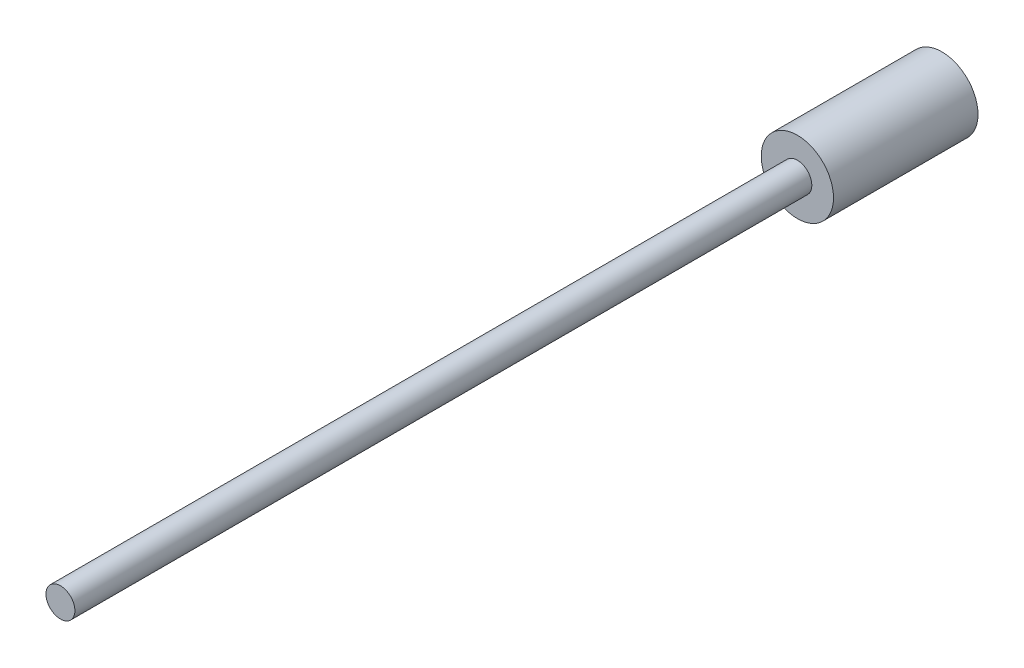
ISO-10303-21;
HEADER;
FILE_DESCRIPTION(('STEP AP214'),'2;1');
FILE_NAME('part.step','',(''),(''),'','','');
FILE_SCHEMA(('AUTOMOTIVE_DESIGN { 1 0 10303 214 1 1 1 1 }'));
ENDSEC;
DATA;
#1=APPLICATION_CONTEXT('core data for automotive mechanical design processes');
#2=APPLICATION_PROTOCOL_DEFINITION('international standard','automotive_design',2000,#1);
#3=PRODUCT_CONTEXT('',#1,'mechanical');
#4=PRODUCT('Part','Part','',(#3));
#5=PRODUCT_RELATED_PRODUCT_CATEGORY('part','',(#4));
#6=PRODUCT_DEFINITION_FORMATION('','',#4);
#7=PRODUCT_DEFINITION_CONTEXT('part definition',#1,'design');
#8=PRODUCT_DEFINITION('design','',#6,#7);
#9=PRODUCT_DEFINITION_SHAPE('','',#8);
#10=(LENGTH_UNIT() NAMED_UNIT(*) SI_UNIT(.MILLI.,.METRE.));
#11=(NAMED_UNIT(*) PLANE_ANGLE_UNIT() SI_UNIT($,.RADIAN.));
#12=(NAMED_UNIT(*) SI_UNIT($,.STERADIAN.) SOLID_ANGLE_UNIT());
#13=UNCERTAINTY_MEASURE_WITH_UNIT(LENGTH_MEASURE(1.E-05),#10,'distance_accuracy_value','');
#14=(GEOMETRIC_REPRESENTATION_CONTEXT(3) GLOBAL_UNCERTAINTY_ASSIGNED_CONTEXT((#13)) GLOBAL_UNIT_ASSIGNED_CONTEXT((#10,
#11,#12)) REPRESENTATION_CONTEXT('',''));
#15=CARTESIAN_POINT('',(0.,0.,0.));
#16=DIRECTION('',(0.,0.,1.));
#17=DIRECTION('',(1.,0.,0.));
#18=AXIS2_PLACEMENT_3D('',#15,#16,#17);
#19=CARTESIAN_POINT('',(0.,0.,-100.));
#20=DIRECTION('',(0.,0.,1.));
#21=DIRECTION('',(1.,0.,0.));
#22=AXIS2_PLACEMENT_3D('',#19,#20,#21);
#23=CYLINDRICAL_SURFACE('',#22,25.);
#24=CARTESIAN_POINT('',(0.,0.,-100.));
#25=DIRECTION('',(0.,0.,1.));
#26=DIRECTION('',(1.,0.,0.));
#27=AXIS2_PLACEMENT_3D('',#24,#25,#26);
#28=CIRCLE('',#27,25.);
#29=CARTESIAN_POINT('',(25.,0.,-100.));
#30=VERTEX_POINT('',#29);
#31=EDGE_CURVE('E45',#30,#30,#28,.T.);
#32=CARTESIAN_POINT('',(0.,0.,0.));
#33=DIRECTION('',(0.,0.,1.));
#34=DIRECTION('',(1.,0.,0.));
#35=AXIS2_PLACEMENT_3D('',#32,#33,#34);
#36=CIRCLE('',#35,25.);
#37=CARTESIAN_POINT('',(25.,0.,0.));
#38=VERTEX_POINT('',#37);
#39=EDGE_CURVE('E40',#38,#38,#36,.T.);
#40=CARTESIAN_POINT('',(25.,0.,-100.));
#41=CARTESIAN_POINT('',(25.,0.,-98.9583333333333));
#42=CARTESIAN_POINT('',(25.,0.,-97.9166666666667));
#43=CARTESIAN_POINT('',(25.,0.,-95.8333333333333));
#44=CARTESIAN_POINT('',(25.,0.,-94.7916666666667));
#45=CARTESIAN_POINT('',(25.,0.,-92.7083333333333));
#46=CARTESIAN_POINT('',(25.,0.,-91.6666666666667));
#47=CARTESIAN_POINT('',(25.,0.,-89.5833333333333));
#48=CARTESIAN_POINT('',(25.,0.,-88.5416666666667));
#49=CARTESIAN_POINT('',(25.,0.,-86.4583333333333));
#50=CARTESIAN_POINT('',(25.,0.,-85.4166666666667));
#51=CARTESIAN_POINT('',(25.,0.,-83.3333333333333));
#52=CARTESIAN_POINT('',(25.,0.,-82.2916666666667));
#53=CARTESIAN_POINT('',(25.,0.,-80.2083333333333));
#54=CARTESIAN_POINT('',(25.,0.,-79.1666666666667));
#55=CARTESIAN_POINT('',(25.,0.,-77.0833333333333));
#56=CARTESIAN_POINT('',(25.,0.,-76.0416666666667));
#57=CARTESIAN_POINT('',(25.,0.,-73.9583333333333));
#58=CARTESIAN_POINT('',(25.,0.,-72.9166666666667));
#59=CARTESIAN_POINT('',(25.,0.,-70.8333333333333));
#60=CARTESIAN_POINT('',(25.,0.,-69.7916666666667));
#61=CARTESIAN_POINT('',(25.,0.,-67.7083333333333));
#62=CARTESIAN_POINT('',(25.,0.,-66.6666666666667));
#63=CARTESIAN_POINT('',(25.,0.,-64.5833333333333));
#64=CARTESIAN_POINT('',(25.,0.,-63.5416666666667));
#65=CARTESIAN_POINT('',(25.,0.,-61.4583333333333));
#66=CARTESIAN_POINT('',(25.,0.,-60.4166666666667));
#67=CARTESIAN_POINT('',(25.,0.,-58.3333333333333));
#68=CARTESIAN_POINT('',(25.,0.,-57.2916666666667));
#69=CARTESIAN_POINT('',(25.,0.,-55.2083333333333));
#70=CARTESIAN_POINT('',(25.,0.,-54.1666666666667));
#71=CARTESIAN_POINT('',(25.,0.,-52.0833333333333));
#72=CARTESIAN_POINT('',(25.,0.,-51.0416666666667));
#73=CARTESIAN_POINT('',(25.,0.,-48.9583333333333));
#74=CARTESIAN_POINT('',(25.,0.,-47.9166666666667));
#75=CARTESIAN_POINT('',(25.,0.,-45.8333333333333));
#76=CARTESIAN_POINT('',(25.,0.,-44.7916666666667));
#77=CARTESIAN_POINT('',(25.,0.,-42.7083333333333));
#78=CARTESIAN_POINT('',(25.,0.,-41.6666666666667));
#79=CARTESIAN_POINT('',(25.,0.,-39.5833333333333));
#80=CARTESIAN_POINT('',(25.,0.,-38.5416666666667));
#81=CARTESIAN_POINT('',(25.,0.,-36.4583333333333));
#82=CARTESIAN_POINT('',(25.,0.,-35.4166666666667));
#83=CARTESIAN_POINT('',(25.,0.,-33.3333333333333));
#84=CARTESIAN_POINT('',(25.,0.,-32.2916666666667));
#85=CARTESIAN_POINT('',(25.,0.,-30.2083333333333));
#86=CARTESIAN_POINT('',(25.,0.,-29.1666666666667));
#87=CARTESIAN_POINT('',(25.,0.,-27.0833333333333));
#88=CARTESIAN_POINT('',(25.,0.,-26.0416666666667));
#89=CARTESIAN_POINT('',(25.,0.,-23.9583333333333));
#90=CARTESIAN_POINT('',(25.,0.,-22.9166666666667));
#91=CARTESIAN_POINT('',(25.,0.,-20.8333333333333));
#92=CARTESIAN_POINT('',(25.,0.,-19.7916666666667));
#93=CARTESIAN_POINT('',(25.,0.,-17.7083333333333));
#94=CARTESIAN_POINT('',(25.,0.,-16.6666666666667));
#95=CARTESIAN_POINT('',(25.,0.,-14.5833333333333));
#96=CARTESIAN_POINT('',(25.,0.,-13.5416666666667));
#97=CARTESIAN_POINT('',(25.,0.,-11.4583333333333));
#98=CARTESIAN_POINT('',(25.,0.,-10.4166666666667));
#99=CARTESIAN_POINT('',(25.,0.,-8.33333333333333));
#100=CARTESIAN_POINT('',(25.,0.,-7.29166666666667));
#101=CARTESIAN_POINT('',(25.,0.,-5.20833333333334));
#102=CARTESIAN_POINT('',(25.,0.,-4.16666666666667));
#103=CARTESIAN_POINT('',(25.,0.,-2.08333333333334));
#104=CARTESIAN_POINT('',(25.,0.,-1.04166666666667));
#105=CARTESIAN_POINT('',(25.,0.,0.));
#106=B_SPLINE_CURVE_WITH_KNOTS('',3,(#40,#41,#42,#43,#44,#45,#46,#47,#48,#49,#50,#51,#52,#53,
#54,#55,#56,#57,#58,#59,#60,#61,#62,#63,#64,#65,#66,#67,#68,#69,#70,#71,#72,#73,#74,#75,#76,#77,
#78,#79,#80,#81,#82,#83,#84,#85,#86,#87,#88,#89,#90,#91,#92,#93,#94,#95,#96,#97,#98,#99,#100,
#101,#102,#103,#104,#105),.UNSPECIFIED.,.F.,.F.,(4,2,2,2,2,2,2,2,2,2,2,2,2,2,2,2,2,2,2,2,2,2,2,
2,2,2,2,2,2,2,2,2,4),(0.,3.12499999999999,6.24999999999999,9.37499999999999,12.5,15.625,18.75,
21.875,25.,28.125,31.25,34.375,37.5,40.625,43.75,46.875,50.,53.125,56.25,59.375,62.5,65.625,
68.75,71.875,75.,78.125,81.25,84.375,87.5,90.625,93.75,96.875,100.),.UNSPECIFIED.);
#107=EDGE_CURVE('BSEAM37',#30,#38,#106,.T.);
#108=ORIENTED_EDGE('',*,*,#31,.T.);
#109=ORIENTED_EDGE('',*,*,#39,.F.);
#110=ORIENTED_EDGE('',*,*,#107,.T.);
#111=ORIENTED_EDGE('',*,*,#107,.F.);
#112=EDGE_LOOP('',(#108,#110,#109,#111));
#113=FACE_BOUND('',#112,.T.);
#114=ADVANCED_FACE('F37',(#113),#23,.T.);
#115=CARTESIAN_POINT('',(0.,0.,-100.));
#116=DIRECTION('',(0.,0.,1.));
#117=DIRECTION('',(1.,0.,0.));
#118=AXIS2_PLACEMENT_3D('',#115,#116,#117);
#119=PLANE('',#118);
#120=ORIENTED_EDGE('',*,*,#31,.F.);
#121=EDGE_LOOP('',(#120));
#122=FACE_BOUND('',#121,.T.);
#123=ADVANCED_FACE('F64',(#122),#119,.F.);
#124=CARTESIAN_POINT('',(0.,0.,0.));
#125=DIRECTION('',(0.,0.,1.));
#126=DIRECTION('',(1.,0.,0.));
#127=AXIS2_PLACEMENT_3D('',#124,#125,#126);
#128=PLANE('',#127);
#129=CARTESIAN_POINT('',(0.,0.,0.));
#130=DIRECTION('',(0.,0.,1.));
#131=DIRECTION('',(1.,0.,0.));
#132=AXIS2_PLACEMENT_3D('',#129,#130,#131);
#133=CIRCLE('',#132,10.);
#134=CARTESIAN_POINT('',(10.,0.,0.));
#135=VERTEX_POINT('',#134);
#136=EDGE_CURVE('E10',#135,#135,#133,.T.);
#137=ORIENTED_EDGE('',*,*,#136,.F.);
#138=EDGE_LOOP('',(#137));
#139=FACE_BOUND('',#138,.T.);
#140=ORIENTED_EDGE('',*,*,#39,.T.);
#141=EDGE_LOOP('',(#140));
#142=FACE_BOUND('',#141,.T.);
#143=ADVANCED_FACE('F61',(#139,#142),#128,.T.);
#144=CARTESIAN_POINT('',(0.,0.,510.));
#145=DIRECTION('',(0.,0.,-1.));
#146=DIRECTION('',(-1.,0.,0.));
#147=AXIS2_PLACEMENT_3D('',#144,#145,#146);
#148=CYLINDRICAL_SURFACE('',#147,10.);
#149=CARTESIAN_POINT('',(0.,0.,510.));
#150=DIRECTION('',(0.,0.,1.));
#151=DIRECTION('',(1.,0.,0.));
#152=AXIS2_PLACEMENT_3D('',#149,#150,#151);
#153=CIRCLE('',#152,10.);
#154=CARTESIAN_POINT('',(10.,0.,510.));
#155=VERTEX_POINT('',#154);
#156=EDGE_CURVE('E52',#155,#155,#153,.T.);
#157=ORIENTED_EDGE('',*,*,#156,.F.);
#158=EDGE_LOOP('',(#157));
#159=FACE_BOUND('',#158,.T.);
#160=ORIENTED_EDGE('',*,*,#136,.T.);
#161=EDGE_LOOP('',(#160));
#162=FACE_BOUND('',#161,.T.);
#163=ADVANCED_FACE('F75',(#159,#162),#148,.T.);
#164=CARTESIAN_POINT('',(0.,0.,510.));
#165=DIRECTION('',(0.,0.,1.));
#166=DIRECTION('',(1.,0.,0.));
#167=AXIS2_PLACEMENT_3D('',#164,#165,#166);
#168=PLANE('',#167);
#169=ORIENTED_EDGE('',*,*,#156,.T.);
#170=EDGE_LOOP('',(#169));
#171=FACE_BOUND('',#170,.T.);
#172=ADVANCED_FACE('F80',(#171),#168,.T.);
#173=CLOSED_SHELL('',(#114,#123,#143,#163,#172));
#174=MANIFOLD_SOLID_BREP('B2',#173);
#175=ADVANCED_BREP_SHAPE_REPRESENTATION('',(#18,#174),#14);
#176=SHAPE_DEFINITION_REPRESENTATION(#9,#175);
ENDSEC;
END-ISO-10303-21;
